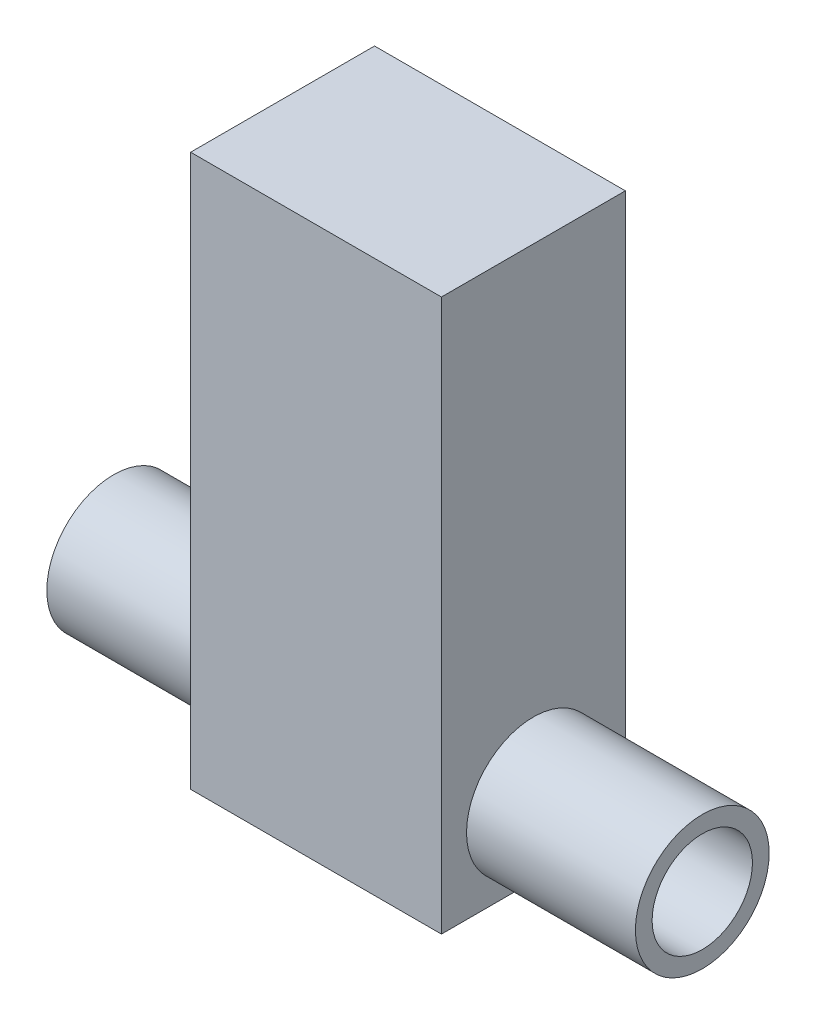
ISO-10303-21;
HEADER;
FILE_DESCRIPTION(('STEP AP214'),'2;1');
FILE_NAME('part.step','',(''),(''),'','','');
FILE_SCHEMA(('AUTOMOTIVE_DESIGN { 1 0 10303 214 1 1 1 1 }'));
ENDSEC;
DATA;
#1=APPLICATION_CONTEXT('core data for automotive mechanical design processes');
#2=APPLICATION_PROTOCOL_DEFINITION('international standard','automotive_design',2000,#1);
#3=PRODUCT_CONTEXT('',#1,'mechanical');
#4=PRODUCT('Part','Part','',(#3));
#5=PRODUCT_RELATED_PRODUCT_CATEGORY('part','',(#4));
#6=PRODUCT_DEFINITION_FORMATION('','',#4);
#7=PRODUCT_DEFINITION_CONTEXT('part definition',#1,'design');
#8=PRODUCT_DEFINITION('design','',#6,#7);
#9=PRODUCT_DEFINITION_SHAPE('','',#8);
#10=(LENGTH_UNIT() NAMED_UNIT(*) SI_UNIT(.MILLI.,.METRE.));
#11=(NAMED_UNIT(*) PLANE_ANGLE_UNIT() SI_UNIT($,.RADIAN.));
#12=(NAMED_UNIT(*) SI_UNIT($,.STERADIAN.) SOLID_ANGLE_UNIT());
#13=UNCERTAINTY_MEASURE_WITH_UNIT(LENGTH_MEASURE(1.E-05),#10,'distance_accuracy_value','');
#14=(GEOMETRIC_REPRESENTATION_CONTEXT(3) GLOBAL_UNCERTAINTY_ASSIGNED_CONTEXT((#13)) GLOBAL_UNIT_ASSIGNED_CONTEXT((#10,
#11,#12)) REPRESENTATION_CONTEXT('',''));
#15=CARTESIAN_POINT('',(0.,0.,0.));
#16=DIRECTION('',(0.,0.,1.));
#17=DIRECTION('',(1.,0.,0.));
#18=AXIS2_PLACEMENT_3D('',#15,#16,#17);
#19=CARTESIAN_POINT('',(15.,66.,11.));
#20=DIRECTION('',(-1.,0.,0.));
#21=DIRECTION('',(0.,0.,1.));
#22=AXIS2_PLACEMENT_3D('',#19,#20,#21);
#23=PLANE('',#22);
#24=CARTESIAN_POINT('',(15.,9.,0.));
#25=DIRECTION('',(-1.,0.,0.));
#26=DIRECTION('',(0.,0.,1.));
#27=AXIS2_PLACEMENT_3D('',#24,#25,#26);
#28=CIRCLE('',#27,8.);
#29=CARTESIAN_POINT('',(15.,9.,8.));
#30=VERTEX_POINT('',#29);
#31=EDGE_CURVE('E11',#30,#30,#28,.F.);
#32=ORIENTED_EDGE('',*,*,#31,.F.);
#33=EDGE_LOOP('',(#32));
#34=FACE_BOUND('',#33,.T.);
#35=DIRECTION('',(0.,0.,-1.));
#36=VECTOR('',#35,1.);
#37=CARTESIAN_POINT('',(15.,0.,11.));
#38=LINE('',#37,#36);
#39=CARTESIAN_POINT('',(15.,0.,11.));
#40=VERTEX_POINT('',#39);
#41=CARTESIAN_POINT('',(15.,0.,-11.));
#42=VERTEX_POINT('',#41);
#43=EDGE_CURVE('E180',#40,#42,#38,.T.);
#44=ORIENTED_EDGE('',*,*,#43,.T.);
#45=DIRECTION('',(0.,-1.,0.));
#46=VECTOR('',#45,1.);
#47=CARTESIAN_POINT('',(15.,66.,-11.));
#48=LINE('',#47,#46);
#49=CARTESIAN_POINT('',(15.,66.,-11.));
#50=VERTEX_POINT('',#49);
#51=EDGE_CURVE('E210',#50,#42,#48,.T.);
#52=ORIENTED_EDGE('',*,*,#51,.F.);
#53=DIRECTION('',(0.,0.,-1.));
#54=VECTOR('',#53,1.);
#55=CARTESIAN_POINT('',(15.,66.,11.));
#56=LINE('',#55,#54);
#57=CARTESIAN_POINT('',(15.,66.,11.));
#58=VERTEX_POINT('',#57);
#59=EDGE_CURVE('E181',#58,#50,#56,.T.);
#60=ORIENTED_EDGE('',*,*,#59,.F.);
#61=DIRECTION('',(0.,-1.,0.));
#62=VECTOR('',#61,1.);
#63=CARTESIAN_POINT('',(15.,66.,11.));
#64=LINE('',#63,#62);
#65=EDGE_CURVE('E191',#58,#40,#64,.T.);
#66=ORIENTED_EDGE('',*,*,#65,.T.);
#67=EDGE_LOOP('',(#44,#52,#60,#66));
#68=FACE_BOUND('',#67,.T.);
#69=ADVANCED_FACE('F43',(#34,#68),#23,.F.);
#70=CARTESIAN_POINT('',(-15.,66.,-11.));
#71=DIRECTION('',(0.,0.,1.));
#72=DIRECTION('',(1.,0.,0.));
#73=AXIS2_PLACEMENT_3D('',#70,#71,#72);
#74=PLANE('',#73);
#75=DIRECTION('',(-1.,0.,0.));
#76=VECTOR('',#75,1.);
#77=CARTESIAN_POINT('',(-15.,0.,-11.));
#78=LINE('',#77,#76);
#79=CARTESIAN_POINT('',(-15.,0.,-11.));
#80=VERTEX_POINT('',#79);
#81=EDGE_CURVE('E195',#42,#80,#78,.T.);
#82=ORIENTED_EDGE('',*,*,#81,.T.);
#83=DIRECTION('',(0.,-1.,0.));
#84=VECTOR('',#83,1.);
#85=CARTESIAN_POINT('',(-15.,66.,-11.));
#86=LINE('',#85,#84);
#87=CARTESIAN_POINT('',(-15.,66.,-11.));
#88=VERTEX_POINT('',#87);
#89=EDGE_CURVE('E207',#88,#80,#86,.T.);
#90=ORIENTED_EDGE('',*,*,#89,.F.);
#91=DIRECTION('',(-1.,0.,0.));
#92=VECTOR('',#91,1.);
#93=CARTESIAN_POINT('',(-15.,66.,-11.));
#94=LINE('',#93,#92);
#95=EDGE_CURVE('E92',#50,#88,#94,.T.);
#96=ORIENTED_EDGE('',*,*,#95,.F.);
#97=ORIENTED_EDGE('',*,*,#51,.T.);
#98=EDGE_LOOP('',(#82,#90,#96,#97));
#99=FACE_BOUND('',#98,.T.);
#100=ADVANCED_FACE('F221',(#99),#74,.F.);
#101=CARTESIAN_POINT('',(-15.,66.,11.));
#102=DIRECTION('',(1.,0.,0.));
#103=DIRECTION('',(0.,0.,-1.));
#104=AXIS2_PLACEMENT_3D('',#101,#102,#103);
#105=PLANE('',#104);
#106=CARTESIAN_POINT('',(-15.,9.,0.));
#107=DIRECTION('',(1.,0.,0.));
#108=DIRECTION('',(0.,0.,-1.));
#109=AXIS2_PLACEMENT_3D('',#106,#107,#108);
#110=CIRCLE('',#109,8.);
#111=CARTESIAN_POINT('',(-15.,9.,-8.));
#112=VERTEX_POINT('',#111);
#113=EDGE_CURVE('E52',#112,#112,#110,.F.);
#114=ORIENTED_EDGE('',*,*,#113,.F.);
#115=EDGE_LOOP('',(#114));
#116=FACE_BOUND('',#115,.T.);
#117=DIRECTION('',(0.,0.,1.));
#118=VECTOR('',#117,1.);
#119=CARTESIAN_POINT('',(-15.,0.,11.));
#120=LINE('',#119,#118);
#121=CARTESIAN_POINT('',(-15.,0.,11.));
#122=VERTEX_POINT('',#121);
#123=EDGE_CURVE('E78',#80,#122,#120,.T.);
#124=ORIENTED_EDGE('',*,*,#123,.T.);
#125=DIRECTION('',(0.,-1.,0.));
#126=VECTOR('',#125,1.);
#127=CARTESIAN_POINT('',(-15.,66.,11.));
#128=LINE('',#127,#126);
#129=CARTESIAN_POINT('',(-15.,66.,11.));
#130=VERTEX_POINT('',#129);
#131=EDGE_CURVE('E204',#130,#122,#128,.T.);
#132=ORIENTED_EDGE('',*,*,#131,.F.);
#133=DIRECTION('',(0.,0.,1.));
#134=VECTOR('',#133,1.);
#135=CARTESIAN_POINT('',(-15.,66.,11.));
#136=LINE('',#135,#134);
#137=EDGE_CURVE('E186',#88,#130,#136,.T.);
#138=ORIENTED_EDGE('',*,*,#137,.F.);
#139=ORIENTED_EDGE('',*,*,#89,.T.);
#140=EDGE_LOOP('',(#124,#132,#138,#139));
#141=FACE_BOUND('',#140,.T.);
#142=ADVANCED_FACE('F218',(#116,#141),#105,.F.);
#143=CARTESIAN_POINT('',(-15.,66.,11.));
#144=DIRECTION('',(0.,0.,-1.));
#145=DIRECTION('',(-1.,0.,0.));
#146=AXIS2_PLACEMENT_3D('',#143,#144,#145);
#147=PLANE('',#146);
#148=DIRECTION('',(1.,0.,0.));
#149=VECTOR('',#148,1.);
#150=CARTESIAN_POINT('',(-15.,0.,11.));
#151=LINE('',#150,#149);
#152=EDGE_CURVE('E84',#122,#40,#151,.T.);
#153=ORIENTED_EDGE('',*,*,#152,.T.);
#154=ORIENTED_EDGE('',*,*,#65,.F.);
#155=DIRECTION('',(1.,0.,0.));
#156=VECTOR('',#155,1.);
#157=CARTESIAN_POINT('',(-15.,66.,11.));
#158=LINE('',#157,#156);
#159=EDGE_CURVE('E60',#130,#58,#158,.T.);
#160=ORIENTED_EDGE('',*,*,#159,.F.);
#161=ORIENTED_EDGE('',*,*,#131,.T.);
#162=EDGE_LOOP('',(#153,#154,#160,#161));
#163=FACE_BOUND('',#162,.T.);
#164=ADVANCED_FACE('F220',(#163),#147,.F.);
#165=CARTESIAN_POINT('',(0.,66.,0.));
#166=DIRECTION('',(0.,-1.,0.));
#167=DIRECTION('',(0.,0.,-1.));
#168=AXIS2_PLACEMENT_3D('',#165,#166,#167);
#169=PLANE('',#168);
#170=ORIENTED_EDGE('',*,*,#59,.T.);
#171=ORIENTED_EDGE('',*,*,#95,.T.);
#172=ORIENTED_EDGE('',*,*,#137,.T.);
#173=ORIENTED_EDGE('',*,*,#159,.T.);
#174=EDGE_LOOP('',(#170,#171,#172,#173));
#175=FACE_BOUND('',#174,.T.);
#176=ADVANCED_FACE('F227',(#175),#169,.F.);
#177=CARTESIAN_POINT('',(0.,0.,0.));
#178=DIRECTION('',(0.,-1.,0.));
#179=DIRECTION('',(0.,0.,-1.));
#180=AXIS2_PLACEMENT_3D('',#177,#178,#179);
#181=PLANE('',#180);
#182=ORIENTED_EDGE('',*,*,#43,.F.);
#183=ORIENTED_EDGE('',*,*,#152,.F.);
#184=ORIENTED_EDGE('',*,*,#123,.F.);
#185=ORIENTED_EDGE('',*,*,#81,.F.);
#186=EDGE_LOOP('',(#182,#183,#184,#185));
#187=FACE_BOUND('',#186,.T.);
#188=ADVANCED_FACE('F239',(#187),#181,.T.);
#189=CARTESIAN_POINT('',(-35.2,9.,0.));
#190=DIRECTION('',(1.,0.,0.));
#191=DIRECTION('',(0.,0.,-1.));
#192=AXIS2_PLACEMENT_3D('',#189,#190,#191);
#193=CYLINDRICAL_SURFACE('',#192,8.);
#194=CARTESIAN_POINT('',(-35.2,9.,0.));
#195=DIRECTION('',(-1.,0.,0.));
#196=DIRECTION('',(0.,0.,1.));
#197=AXIS2_PLACEMENT_3D('',#194,#195,#196);
#198=CIRCLE('',#197,8.);
#199=CARTESIAN_POINT('',(-35.2,9.,8.));
#200=VERTEX_POINT('',#199);
#201=EDGE_CURVE('E175',#200,#200,#198,.T.);
#202=ORIENTED_EDGE('',*,*,#201,.F.);
#203=EDGE_LOOP('',(#202));
#204=FACE_BOUND('',#203,.T.);
#205=ORIENTED_EDGE('',*,*,#113,.T.);
#206=EDGE_LOOP('',(#205));
#207=FACE_BOUND('',#206,.T.);
#208=ADVANCED_FACE('F216',(#204,#207),#193,.T.);
#209=CARTESIAN_POINT('',(-35.2,9.,0.));
#210=DIRECTION('',(-1.,0.,0.));
#211=DIRECTION('',(0.,0.,1.));
#212=AXIS2_PLACEMENT_3D('',#209,#210,#211);
#213=PLANE('',#212);
#214=CARTESIAN_POINT('',(-35.2,9.,0.));
#215=DIRECTION('',(-1.,0.,0.));
#216=DIRECTION('',(0.,0.,1.));
#217=AXIS2_PLACEMENT_3D('',#214,#215,#216);
#218=CIRCLE('',#217,6.);
#219=CARTESIAN_POINT('',(-35.2,9.,6.));
#220=VERTEX_POINT('',#219);
#221=EDGE_CURVE('E163',#220,#220,#218,.T.);
#222=ORIENTED_EDGE('',*,*,#221,.F.);
#223=EDGE_LOOP('',(#222));
#224=FACE_BOUND('',#223,.T.);
#225=ORIENTED_EDGE('',*,*,#201,.T.);
#226=EDGE_LOOP('',(#225));
#227=FACE_BOUND('',#226,.T.);
#228=ADVANCED_FACE('F250',(#224,#227),#213,.T.);
#229=CARTESIAN_POINT('',(35.2,9.,0.));
#230=DIRECTION('',(-1.,0.,0.));
#231=DIRECTION('',(0.,0.,1.));
#232=AXIS2_PLACEMENT_3D('',#229,#230,#231);
#233=CYLINDRICAL_SURFACE('',#232,8.);
#234=CARTESIAN_POINT('',(35.2,9.,0.));
#235=DIRECTION('',(1.,0.,0.));
#236=DIRECTION('',(0.,0.,-1.));
#237=AXIS2_PLACEMENT_3D('',#234,#235,#236);
#238=CIRCLE('',#237,8.);
#239=CARTESIAN_POINT('',(35.2,9.,-8.));
#240=VERTEX_POINT('',#239);
#241=EDGE_CURVE('E171',#240,#240,#238,.T.);
#242=ORIENTED_EDGE('',*,*,#241,.F.);
#243=EDGE_LOOP('',(#242));
#244=FACE_BOUND('',#243,.T.);
#245=ORIENTED_EDGE('',*,*,#31,.T.);
#246=EDGE_LOOP('',(#245));
#247=FACE_BOUND('',#246,.T.);
#248=ADVANCED_FACE('F254',(#244,#247),#233,.T.);
#249=CARTESIAN_POINT('',(35.2,9.,0.));
#250=DIRECTION('',(1.,0.,0.));
#251=DIRECTION('',(0.,0.,-1.));
#252=AXIS2_PLACEMENT_3D('',#249,#250,#251);
#253=PLANE('',#252);
#254=CARTESIAN_POINT('',(35.2,9.,0.));
#255=DIRECTION('',(1.,0.,0.));
#256=DIRECTION('',(0.,0.,-1.));
#257=AXIS2_PLACEMENT_3D('',#254,#255,#256);
#258=CIRCLE('',#257,6.);
#259=CARTESIAN_POINT('',(35.2,9.,-6.));
#260=VERTEX_POINT('',#259);
#261=EDGE_CURVE('E167',#260,#260,#258,.T.);
#262=ORIENTED_EDGE('',*,*,#261,.F.);
#263=EDGE_LOOP('',(#262));
#264=FACE_BOUND('',#263,.T.);
#265=ORIENTED_EDGE('',*,*,#241,.T.);
#266=EDGE_LOOP('',(#265));
#267=FACE_BOUND('',#266,.T.);
#268=ADVANCED_FACE('F258',(#264,#267),#253,.T.);
#269=CARTESIAN_POINT('',(13.,66.,11.));
#270=DIRECTION('',(-1.,0.,0.));
#271=DIRECTION('',(0.,0.,1.));
#272=AXIS2_PLACEMENT_3D('',#269,#270,#271);
#273=PLANE('',#272);
#274=CARTESIAN_POINT('',(13.,9.,0.));
#275=DIRECTION('',(-1.,0.,0.));
#276=DIRECTION('',(0.,0.,1.));
#277=AXIS2_PLACEMENT_3D('',#274,#275,#276);
#278=CIRCLE('',#277,6.);
#279=CARTESIAN_POINT('',(13.,9.,6.));
#280=VERTEX_POINT('',#279);
#281=EDGE_CURVE('E176',#280,#280,#278,.F.);
#282=ORIENTED_EDGE('',*,*,#281,.T.);
#283=EDGE_LOOP('',(#282));
#284=FACE_BOUND('',#283,.T.);
#285=DIRECTION('',(0.,0.,-1.));
#286=VECTOR('',#285,1.);
#287=CARTESIAN_POINT('',(13.,2.,0.));
#288=LINE('',#287,#286);
#289=CARTESIAN_POINT('',(13.,2.,9.));
#290=VERTEX_POINT('',#289);
#291=CARTESIAN_POINT('',(13.,2.,-9.));
#292=VERTEX_POINT('',#291);
#293=EDGE_CURVE('E125',#290,#292,#288,.T.);
#294=ORIENTED_EDGE('',*,*,#293,.F.);
#295=DIRECTION('',(0.,-1.,0.));
#296=VECTOR('',#295,1.);
#297=CARTESIAN_POINT('',(13.,66.,9.));
#298=LINE('',#297,#296);
#299=CARTESIAN_POINT('',(13.,64.,9.));
#300=VERTEX_POINT('',#299);
#301=EDGE_CURVE('E156',#300,#290,#298,.T.);
#302=ORIENTED_EDGE('',*,*,#301,.F.);
#303=DIRECTION('',(0.,0.,-1.));
#304=VECTOR('',#303,1.);
#305=CARTESIAN_POINT('',(13.,64.,0.));
#306=LINE('',#305,#304);
#307=CARTESIAN_POINT('',(13.,64.,-9.));
#308=VERTEX_POINT('',#307);
#309=EDGE_CURVE('E148',#300,#308,#306,.T.);
#310=ORIENTED_EDGE('',*,*,#309,.T.);
#311=DIRECTION('',(0.,-1.,0.));
#312=VECTOR('',#311,1.);
#313=CARTESIAN_POINT('',(13.,66.,-9.));
#314=LINE('',#313,#312);
#315=EDGE_CURVE('E138',#308,#292,#314,.T.);
#316=ORIENTED_EDGE('',*,*,#315,.T.);
#317=EDGE_LOOP('',(#294,#302,#310,#316));
#318=FACE_BOUND('',#317,.T.);
#319=ADVANCED_FACE('F262',(#284,#318),#273,.T.);
#320=CARTESIAN_POINT('',(-15.,66.,-9.));
#321=DIRECTION('',(0.,0.,1.));
#322=DIRECTION('',(1.,0.,0.));
#323=AXIS2_PLACEMENT_3D('',#320,#321,#322);
#324=PLANE('',#323);
#325=DIRECTION('',(-1.,0.,0.));
#326=VECTOR('',#325,1.);
#327=CARTESIAN_POINT('',(0.,2.,-9.));
#328=LINE('',#327,#326);
#329=CARTESIAN_POINT('',(-13.,2.,-9.));
#330=VERTEX_POINT('',#329);
#331=EDGE_CURVE('E118',#292,#330,#328,.T.);
#332=ORIENTED_EDGE('',*,*,#331,.F.);
#333=ORIENTED_EDGE('',*,*,#315,.F.);
#334=DIRECTION('',(-1.,0.,0.));
#335=VECTOR('',#334,1.);
#336=CARTESIAN_POINT('',(0.,64.,-9.));
#337=LINE('',#336,#335);
#338=CARTESIAN_POINT('',(-13.,64.,-9.));
#339=VERTEX_POINT('',#338);
#340=EDGE_CURVE('E134',#308,#339,#337,.T.);
#341=ORIENTED_EDGE('',*,*,#340,.T.);
#342=DIRECTION('',(0.,-1.,0.));
#343=VECTOR('',#342,1.);
#344=CARTESIAN_POINT('',(-13.,66.,-9.));
#345=LINE('',#344,#343);
#346=EDGE_CURVE('E132',#339,#330,#345,.T.);
#347=ORIENTED_EDGE('',*,*,#346,.T.);
#348=EDGE_LOOP('',(#332,#333,#341,#347));
#349=FACE_BOUND('',#348,.T.);
#350=ADVANCED_FACE('F133',(#349),#324,.T.);
#351=CARTESIAN_POINT('',(-13.,66.,11.));
#352=DIRECTION('',(1.,0.,0.));
#353=DIRECTION('',(0.,0.,-1.));
#354=AXIS2_PLACEMENT_3D('',#351,#352,#353);
#355=PLANE('',#354);
#356=CARTESIAN_POINT('',(-13.,9.,0.));
#357=DIRECTION('',(1.,0.,0.));
#358=DIRECTION('',(0.,0.,-1.));
#359=AXIS2_PLACEMENT_3D('',#356,#357,#358);
#360=CIRCLE('',#359,6.);
#361=CARTESIAN_POINT('',(-13.,9.,-6.));
#362=VERTEX_POINT('',#361);
#363=EDGE_CURVE('E152',#362,#362,#360,.F.);
#364=ORIENTED_EDGE('',*,*,#363,.T.);
#365=EDGE_LOOP('',(#364));
#366=FACE_BOUND('',#365,.T.);
#367=DIRECTION('',(0.,0.,1.));
#368=VECTOR('',#367,1.);
#369=CARTESIAN_POINT('',(-13.,2.,0.));
#370=LINE('',#369,#368);
#371=CARTESIAN_POINT('',(-13.,2.,9.));
#372=VERTEX_POINT('',#371);
#373=EDGE_CURVE('E122',#330,#372,#370,.T.);
#374=ORIENTED_EDGE('',*,*,#373,.F.);
#375=ORIENTED_EDGE('',*,*,#346,.F.);
#376=DIRECTION('',(0.,0.,1.));
#377=VECTOR('',#376,1.);
#378=CARTESIAN_POINT('',(-13.,64.,0.));
#379=LINE('',#378,#377);
#380=CARTESIAN_POINT('',(-13.,64.,9.));
#381=VERTEX_POINT('',#380);
#382=EDGE_CURVE('E157',#339,#381,#379,.T.);
#383=ORIENTED_EDGE('',*,*,#382,.T.);
#384=DIRECTION('',(0.,-1.,0.));
#385=VECTOR('',#384,1.);
#386=CARTESIAN_POINT('',(-13.,66.,9.));
#387=LINE('',#386,#385);
#388=EDGE_CURVE('E139',#381,#372,#387,.T.);
#389=ORIENTED_EDGE('',*,*,#388,.T.);
#390=EDGE_LOOP('',(#374,#375,#383,#389));
#391=FACE_BOUND('',#390,.T.);
#392=ADVANCED_FACE('F141',(#366,#391),#355,.T.);
#393=CARTESIAN_POINT('',(-15.,66.,9.));
#394=DIRECTION('',(0.,0.,-1.));
#395=DIRECTION('',(-1.,0.,0.));
#396=AXIS2_PLACEMENT_3D('',#393,#394,#395);
#397=PLANE('',#396);
#398=DIRECTION('',(1.,0.,0.));
#399=VECTOR('',#398,1.);
#400=CARTESIAN_POINT('',(0.,2.,9.));
#401=LINE('',#400,#399);
#402=EDGE_CURVE('E145',#372,#290,#401,.T.);
#403=ORIENTED_EDGE('',*,*,#402,.F.);
#404=ORIENTED_EDGE('',*,*,#388,.F.);
#405=DIRECTION('',(1.,0.,0.));
#406=VECTOR('',#405,1.);
#407=CARTESIAN_POINT('',(0.,64.,9.));
#408=LINE('',#407,#406);
#409=EDGE_CURVE('E159',#381,#300,#408,.T.);
#410=ORIENTED_EDGE('',*,*,#409,.T.);
#411=ORIENTED_EDGE('',*,*,#301,.T.);
#412=EDGE_LOOP('',(#403,#404,#410,#411));
#413=FACE_BOUND('',#412,.T.);
#414=ADVANCED_FACE('F277',(#413),#397,.T.);
#415=CARTESIAN_POINT('',(0.,64.,0.));
#416=DIRECTION('',(0.,-1.,0.));
#417=DIRECTION('',(0.,0.,-1.));
#418=AXIS2_PLACEMENT_3D('',#415,#416,#417);
#419=PLANE('',#418);
#420=ORIENTED_EDGE('',*,*,#309,.F.);
#421=ORIENTED_EDGE('',*,*,#409,.F.);
#422=ORIENTED_EDGE('',*,*,#382,.F.);
#423=ORIENTED_EDGE('',*,*,#340,.F.);
#424=EDGE_LOOP('',(#420,#421,#422,#423));
#425=FACE_BOUND('',#424,.T.);
#426=ADVANCED_FACE('F274',(#425),#419,.T.);
#427=CARTESIAN_POINT('',(0.,2.,0.));
#428=DIRECTION('',(0.,-1.,0.));
#429=DIRECTION('',(0.,0.,-1.));
#430=AXIS2_PLACEMENT_3D('',#427,#428,#429);
#431=PLANE('',#430);
#432=ORIENTED_EDGE('',*,*,#293,.T.);
#433=ORIENTED_EDGE('',*,*,#331,.T.);
#434=ORIENTED_EDGE('',*,*,#373,.T.);
#435=ORIENTED_EDGE('',*,*,#402,.T.);
#436=EDGE_LOOP('',(#432,#433,#434,#435));
#437=FACE_BOUND('',#436,.T.);
#438=ADVANCED_FACE('F120',(#437),#431,.F.);
#439=CARTESIAN_POINT('',(-35.2,9.,0.));
#440=DIRECTION('',(1.,0.,0.));
#441=DIRECTION('',(0.,0.,-1.));
#442=AXIS2_PLACEMENT_3D('',#439,#440,#441);
#443=CYLINDRICAL_SURFACE('',#442,6.);
#444=ORIENTED_EDGE('',*,*,#221,.T.);
#445=EDGE_LOOP('',(#444));
#446=FACE_BOUND('',#445,.T.);
#447=ORIENTED_EDGE('',*,*,#363,.F.);
#448=EDGE_LOOP('',(#447));
#449=FACE_BOUND('',#448,.T.);
#450=ADVANCED_FACE('F267',(#446,#449),#443,.F.);
#451=CARTESIAN_POINT('',(35.2,9.,0.));
#452=DIRECTION('',(-1.,0.,0.));
#453=DIRECTION('',(0.,0.,1.));
#454=AXIS2_PLACEMENT_3D('',#451,#452,#453);
#455=CYLINDRICAL_SURFACE('',#454,6.);
#456=ORIENTED_EDGE('',*,*,#261,.T.);
#457=EDGE_LOOP('',(#456));
#458=FACE_BOUND('',#457,.T.);
#459=ORIENTED_EDGE('',*,*,#281,.F.);
#460=EDGE_LOOP('',(#459));
#461=FACE_BOUND('',#460,.T.);
#462=ADVANCED_FACE('F264',(#458,#461),#455,.F.);
#463=CLOSED_SHELL('',(#69,#100,#142,#164,#176,#188,#208,#228,#248,#268,#319,#350,#392,#414,#426,
#438,#450,#462));
#464=MANIFOLD_SOLID_BREP('B2',#463);
#465=ADVANCED_BREP_SHAPE_REPRESENTATION('',(#18,#464),#14);
#466=SHAPE_DEFINITION_REPRESENTATION(#9,#465);
ENDSEC;
END-ISO-10303-21;
